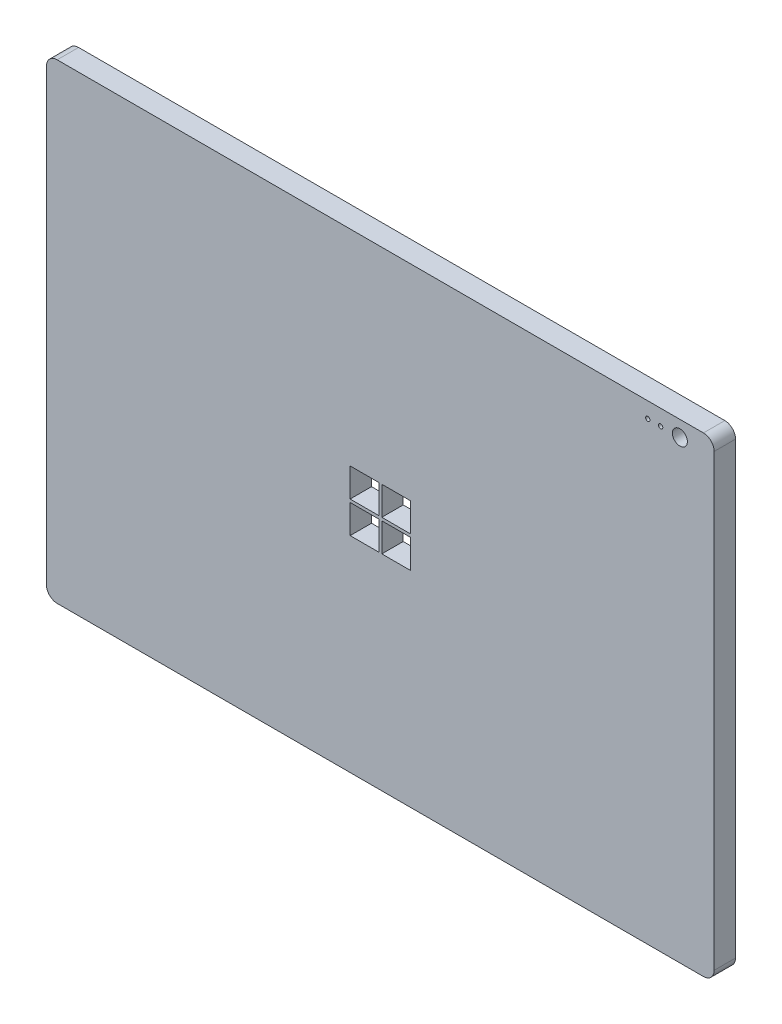
ISO-10303-21;
HEADER;
FILE_DESCRIPTION(('STEP AP214'),'2;1');
FILE_NAME('part.step','',(''),(''),'','','');
FILE_SCHEMA(('AUTOMOTIVE_DESIGN { 1 0 10303 214 1 1 1 1 }'));
ENDSEC;
DATA;
#1=APPLICATION_CONTEXT('core data for automotive mechanical design processes');
#2=APPLICATION_PROTOCOL_DEFINITION('international standard','automotive_design',2000,#1);
#3=PRODUCT_CONTEXT('',#1,'mechanical');
#4=PRODUCT('Part','Part','',(#3));
#5=PRODUCT_RELATED_PRODUCT_CATEGORY('part','',(#4));
#6=PRODUCT_DEFINITION_FORMATION('','',#4);
#7=PRODUCT_DEFINITION_CONTEXT('part definition',#1,'design');
#8=PRODUCT_DEFINITION('design','',#6,#7);
#9=PRODUCT_DEFINITION_SHAPE('','',#8);
#10=(LENGTH_UNIT() NAMED_UNIT(*) SI_UNIT(.MILLI.,.METRE.));
#11=(NAMED_UNIT(*) PLANE_ANGLE_UNIT() SI_UNIT($,.RADIAN.));
#12=(NAMED_UNIT(*) SI_UNIT($,.STERADIAN.) SOLID_ANGLE_UNIT());
#13=UNCERTAINTY_MEASURE_WITH_UNIT(LENGTH_MEASURE(1.E-05),#10,'distance_accuracy_value','');
#14=(GEOMETRIC_REPRESENTATION_CONTEXT(3) GLOBAL_UNCERTAINTY_ASSIGNED_CONTEXT((#13)) GLOBAL_UNIT_ASSIGNED_CONTEXT((#10,
#11,#12)) REPRESENTATION_CONTEXT('',''));
#15=CARTESIAN_POINT('',(0.,0.,0.));
#16=DIRECTION('',(0.,0.,1.));
#17=DIRECTION('',(1.,0.,0.));
#18=AXIS2_PLACEMENT_3D('',#15,#16,#17);
#19=CARTESIAN_POINT('',(0.,0.,10.));
#20=DIRECTION('',(0.,0.,-1.));
#21=DIRECTION('',(-1.,0.,0.));
#22=AXIS2_PLACEMENT_3D('',#19,#20,#21);
#23=PLANE('',#22);
#24=DIRECTION('',(0.,-1.,0.));
#25=VECTOR('',#24,1.);
#26=CARTESIAN_POINT('',(141.9,109.3,10.));
#27=LINE('',#26,#25);
#28=CARTESIAN_POINT('',(141.9,109.3,10.));
#29=VERTEX_POINT('',#28);
#30=CARTESIAN_POINT('',(141.9,95.9,10.));
#31=VERTEX_POINT('',#30);
#32=EDGE_CURVE('E436',#29,#31,#27,.T.);
#33=ORIENTED_EDGE('',*,*,#32,.F.);
#34=DIRECTION('',(-1.,0.,0.));
#35=VECTOR('',#34,1.);
#36=CARTESIAN_POINT('',(141.9,109.3,10.));
#37=LINE('',#36,#35);
#38=CARTESIAN_POINT('',(155.3,109.3,10.));
#39=VERTEX_POINT('',#38);
#40=EDGE_CURVE('E449',#39,#29,#37,.T.);
#41=ORIENTED_EDGE('',*,*,#40,.F.);
#42=DIRECTION('',(0.,1.,0.));
#43=VECTOR('',#42,1.);
#44=CARTESIAN_POINT('',(155.3,109.3,10.));
#45=LINE('',#44,#43);
#46=CARTESIAN_POINT('',(155.3,95.9,10.));
#47=VERTEX_POINT('',#46);
#48=EDGE_CURVE('E454',#47,#39,#45,.T.);
#49=ORIENTED_EDGE('',*,*,#48,.F.);
#50=DIRECTION('',(1.,0.,0.));
#51=VECTOR('',#50,1.);
#52=CARTESIAN_POINT('',(141.9,95.9,10.));
#53=LINE('',#52,#51);
#54=EDGE_CURVE('E440',#31,#47,#53,.T.);
#55=ORIENTED_EDGE('',*,*,#54,.F.);
#56=EDGE_LOOP('',(#33,#41,#49,#55));
#57=FACE_BOUND('',#56,.T.);
#58=DIRECTION('',(0.,-1.,0.));
#59=VECTOR('',#58,1.);
#60=CARTESIAN_POINT('',(141.9,124.1,10.));
#61=LINE('',#60,#59);
#62=CARTESIAN_POINT('',(141.9,124.1,10.));
#63=VERTEX_POINT('',#62);
#64=CARTESIAN_POINT('',(141.9,110.7,10.));
#65=VERTEX_POINT('',#64);
#66=EDGE_CURVE('E502',#63,#65,#61,.T.);
#67=ORIENTED_EDGE('',*,*,#66,.F.);
#68=DIRECTION('',(-1.,0.,0.));
#69=VECTOR('',#68,1.);
#70=CARTESIAN_POINT('',(141.9,124.1,10.));
#71=LINE('',#70,#69);
#72=CARTESIAN_POINT('',(155.3,124.1,10.));
#73=VERTEX_POINT('',#72);
#74=EDGE_CURVE('E515',#73,#63,#71,.T.);
#75=ORIENTED_EDGE('',*,*,#74,.F.);
#76=DIRECTION('',(0.,1.,0.));
#77=VECTOR('',#76,1.);
#78=CARTESIAN_POINT('',(155.3,124.1,10.));
#79=LINE('',#78,#77);
#80=CARTESIAN_POINT('',(155.3,110.7,10.));
#81=VERTEX_POINT('',#80);
#82=EDGE_CURVE('E520',#81,#73,#79,.T.);
#83=ORIENTED_EDGE('',*,*,#82,.F.);
#84=DIRECTION('',(1.,0.,0.));
#85=VECTOR('',#84,1.);
#86=CARTESIAN_POINT('',(141.9,110.7,10.));
#87=LINE('',#86,#85);
#88=EDGE_CURVE('E506',#65,#81,#87,.T.);
#89=ORIENTED_EDGE('',*,*,#88,.F.);
#90=EDGE_LOOP('',(#67,#75,#83,#89));
#91=FACE_BOUND('',#90,.T.);
#92=DIRECTION('',(-1.,0.,0.));
#93=VECTOR('',#92,1.);
#94=CARTESIAN_POINT('',(0.,220.,10.));
#95=LINE('',#94,#93);
#96=CARTESIAN_POINT('',(307.,220.,10.));
#97=VERTEX_POINT('',#96);
#98=CARTESIAN_POINT('',(5.,220.,10.));
#99=VERTEX_POINT('',#98);
#100=EDGE_CURVE('E367',#97,#99,#95,.T.);
#101=ORIENTED_EDGE('',*,*,#100,.T.);
#102=CARTESIAN_POINT('',(5.,215.,10.));
#103=DIRECTION('',(0.,0.,-1.));
#104=DIRECTION('',(-1.,0.,0.));
#105=AXIS2_PLACEMENT_3D('',#102,#103,#104);
#106=CIRCLE('',#105,5.);
#107=CARTESIAN_POINT('',(0.,215.,10.));
#108=VERTEX_POINT('',#107);
#109=EDGE_CURVE('E327',#99,#108,#106,.F.);
#110=ORIENTED_EDGE('',*,*,#109,.T.);
#111=DIRECTION('',(0.,-1.,0.));
#112=VECTOR('',#111,1.);
#113=CARTESIAN_POINT('',(0.,0.,10.));
#114=LINE('',#113,#112);
#115=CARTESIAN_POINT('',(0.,5.,10.));
#116=VERTEX_POINT('',#115);
#117=EDGE_CURVE('E363',#108,#116,#114,.T.);
#118=ORIENTED_EDGE('',*,*,#117,.T.);
#119=CARTESIAN_POINT('',(5.,5.,10.));
#120=DIRECTION('',(0.,0.,-1.));
#121=DIRECTION('',(-1.,0.,0.));
#122=AXIS2_PLACEMENT_3D('',#119,#120,#121);
#123=CIRCLE('',#122,5.);
#124=CARTESIAN_POINT('',(5.,0.,10.));
#125=VERTEX_POINT('',#124);
#126=EDGE_CURVE('E321',#116,#125,#123,.F.);
#127=ORIENTED_EDGE('',*,*,#126,.T.);
#128=DIRECTION('',(1.,0.,0.));
#129=VECTOR('',#128,1.);
#130=CARTESIAN_POINT('',(0.,0.,10.));
#131=LINE('',#130,#129);
#132=CARTESIAN_POINT('',(307.,0.,10.));
#133=VERTEX_POINT('',#132);
#134=EDGE_CURVE('E344',#125,#133,#131,.T.);
#135=ORIENTED_EDGE('',*,*,#134,.T.);
#136=CARTESIAN_POINT('',(307.,5.,10.));
#137=DIRECTION('',(0.,0.,-1.));
#138=DIRECTION('',(-1.,0.,0.));
#139=AXIS2_PLACEMENT_3D('',#136,#137,#138);
#140=CIRCLE('',#139,5.);
#141=CARTESIAN_POINT('',(312.,5.,10.));
#142=VERTEX_POINT('',#141);
#143=EDGE_CURVE('E59',#133,#142,#140,.F.);
#144=ORIENTED_EDGE('',*,*,#143,.T.);
#145=DIRECTION('',(0.,1.,0.));
#146=VECTOR('',#145,1.);
#147=CARTESIAN_POINT('',(312.,0.,10.));
#148=LINE('',#147,#146);
#149=CARTESIAN_POINT('',(312.,215.,10.));
#150=VERTEX_POINT('',#149);
#151=EDGE_CURVE('E389',#142,#150,#148,.T.);
#152=ORIENTED_EDGE('',*,*,#151,.T.);
#153=CARTESIAN_POINT('',(307.,215.,10.));
#154=DIRECTION('',(0.,0.,-1.));
#155=DIRECTION('',(-1.,0.,0.));
#156=AXIS2_PLACEMENT_3D('',#153,#154,#155);
#157=CIRCLE('',#156,5.);
#158=EDGE_CURVE('E322',#150,#97,#157,.F.);
#159=ORIENTED_EDGE('',*,*,#158,.T.);
#160=EDGE_LOOP('',(#101,#110,#118,#127,#135,#144,#152,#159));
#161=FACE_BOUND('',#160,.T.);
#162=DIRECTION('',(0.,-1.,0.));
#163=VECTOR('',#162,1.);
#164=CARTESIAN_POINT('',(156.7,124.1,10.));
#165=LINE('',#164,#163);
#166=CARTESIAN_POINT('',(156.7,124.1,10.));
#167=VERTEX_POINT('',#166);
#168=CARTESIAN_POINT('',(156.7,110.7,10.));
#169=VERTEX_POINT('',#168);
#170=EDGE_CURVE('E406',#167,#169,#165,.T.);
#171=ORIENTED_EDGE('',*,*,#170,.F.);
#172=DIRECTION('',(-1.,0.,0.));
#173=VECTOR('',#172,1.);
#174=CARTESIAN_POINT('',(156.7,124.1,10.));
#175=LINE('',#174,#173);
#176=CARTESIAN_POINT('',(170.1,124.1,10.));
#177=VERTEX_POINT('',#176);
#178=EDGE_CURVE('E485',#177,#167,#175,.T.);
#179=ORIENTED_EDGE('',*,*,#178,.F.);
#180=DIRECTION('',(0.,1.,0.));
#181=VECTOR('',#180,1.);
#182=CARTESIAN_POINT('',(170.1,124.1,10.));
#183=LINE('',#182,#181);
#184=CARTESIAN_POINT('',(170.1,110.7,10.));
#185=VERTEX_POINT('',#184);
#186=EDGE_CURVE('E418',#185,#177,#183,.T.);
#187=ORIENTED_EDGE('',*,*,#186,.F.);
#188=DIRECTION('',(1.,0.,0.));
#189=VECTOR('',#188,1.);
#190=CARTESIAN_POINT('',(156.7,110.7,10.));
#191=LINE('',#190,#189);
#192=EDGE_CURVE('E411',#169,#185,#191,.T.);
#193=ORIENTED_EDGE('',*,*,#192,.F.);
#194=EDGE_LOOP('',(#171,#179,#187,#193));
#195=FACE_BOUND('',#194,.T.);
#196=DIRECTION('',(0.,-1.,0.));
#197=VECTOR('',#196,1.);
#198=CARTESIAN_POINT('',(156.7,109.3,10.));
#199=LINE('',#198,#197);
#200=CARTESIAN_POINT('',(156.7,109.3,10.));
#201=VERTEX_POINT('',#200);
#202=CARTESIAN_POINT('',(156.7,95.9,10.));
#203=VERTEX_POINT('',#202);
#204=EDGE_CURVE('E201',#201,#203,#199,.T.);
#205=ORIENTED_EDGE('',*,*,#204,.F.);
#206=DIRECTION('',(-1.,0.,0.));
#207=VECTOR('',#206,1.);
#208=CARTESIAN_POINT('',(156.7,109.3,10.));
#209=LINE('',#208,#207);
#210=CARTESIAN_POINT('',(170.1,109.3,10.));
#211=VERTEX_POINT('',#210);
#212=EDGE_CURVE('E231',#211,#201,#209,.T.);
#213=ORIENTED_EDGE('',*,*,#212,.F.);
#214=DIRECTION('',(0.,1.,0.));
#215=VECTOR('',#214,1.);
#216=CARTESIAN_POINT('',(170.1,109.3,10.));
#217=LINE('',#216,#215);
#218=CARTESIAN_POINT('',(170.1,95.9,10.));
#219=VERTEX_POINT('',#218);
#220=EDGE_CURVE('E226',#219,#211,#217,.T.);
#221=ORIENTED_EDGE('',*,*,#220,.F.);
#222=DIRECTION('',(1.,0.,0.));
#223=VECTOR('',#222,1.);
#224=CARTESIAN_POINT('',(156.7,95.9,10.));
#225=LINE('',#224,#223);
#226=EDGE_CURVE('E212',#203,#219,#225,.T.);
#227=ORIENTED_EDGE('',*,*,#226,.F.);
#228=EDGE_LOOP('',(#205,#213,#221,#227));
#229=FACE_BOUND('',#228,.T.);
#230=CARTESIAN_POINT('',(296.,212.7,10.));
#231=DIRECTION('',(0.,0.,1.));
#232=DIRECTION('',(1.,0.,0.));
#233=AXIS2_PLACEMENT_3D('',#230,#231,#232);
#234=CIRCLE('',#233,3.50000000000002);
#235=CARTESIAN_POINT('',(299.5,212.7,10.));
#236=VERTEX_POINT('',#235);
#237=EDGE_CURVE('E244',#236,#236,#234,.T.);
#238=ORIENTED_EDGE('',*,*,#237,.F.);
#239=EDGE_LOOP('',(#238));
#240=FACE_BOUND('',#239,.T.);
#241=CARTESIAN_POINT('',(287.,212.7,10.));
#242=DIRECTION('',(0.,0.,1.));
#243=DIRECTION('',(1.,0.,0.));
#244=AXIS2_PLACEMENT_3D('',#241,#242,#243);
#245=CIRCLE('',#244,0.999999999999998);
#246=CARTESIAN_POINT('',(288.,212.7,10.));
#247=VERTEX_POINT('',#246);
#248=EDGE_CURVE('E252',#247,#247,#245,.T.);
#249=ORIENTED_EDGE('',*,*,#248,.F.);
#250=EDGE_LOOP('',(#249));
#251=FACE_BOUND('',#250,.T.);
#252=CARTESIAN_POINT('',(281.,212.7,10.));
#253=DIRECTION('',(0.,0.,1.));
#254=DIRECTION('',(1.,0.,0.));
#255=AXIS2_PLACEMENT_3D('',#252,#253,#254);
#256=CIRCLE('',#255,0.999999999999998);
#257=CARTESIAN_POINT('',(282.,212.7,10.));
#258=VERTEX_POINT('',#257);
#259=EDGE_CURVE('E261',#258,#258,#256,.T.);
#260=ORIENTED_EDGE('',*,*,#259,.F.);
#261=EDGE_LOOP('',(#260));
#262=FACE_BOUND('',#261,.T.);
#263=ADVANCED_FACE('F38',(#57,#91,#161,#195,#229,#240,#251,#262),#23,.F.);
#264=CARTESIAN_POINT('',(0.,0.,0.));
#265=DIRECTION('',(0.,0.,-1.));
#266=DIRECTION('',(-1.,0.,0.));
#267=AXIS2_PLACEMENT_3D('',#264,#265,#266);
#268=PLANE('',#267);
#269=CARTESIAN_POINT('',(287.,212.7,0.));
#270=DIRECTION('',(0.,0.,1.));
#271=DIRECTION('',(1.,0.,0.));
#272=AXIS2_PLACEMENT_3D('',#269,#270,#271);
#273=CIRCLE('',#272,0.999999999999998);
#274=CARTESIAN_POINT('',(288.,212.7,0.));
#275=VERTEX_POINT('',#274);
#276=EDGE_CURVE('E250',#275,#275,#273,.T.);
#277=ORIENTED_EDGE('',*,*,#276,.T.);
#278=EDGE_LOOP('',(#277));
#279=FACE_BOUND('',#278,.T.);
#280=DIRECTION('',(-1.,0.,0.));
#281=VECTOR('',#280,1.);
#282=CARTESIAN_POINT('',(156.7,109.3,0.));
#283=LINE('',#282,#281);
#284=CARTESIAN_POINT('',(170.1,109.3,0.));
#285=VERTEX_POINT('',#284);
#286=CARTESIAN_POINT('',(156.7,109.3,0.));
#287=VERTEX_POINT('',#286);
#288=EDGE_CURVE('E213',#285,#287,#283,.T.);
#289=ORIENTED_EDGE('',*,*,#288,.T.);
#290=DIRECTION('',(0.,-1.,0.));
#291=VECTOR('',#290,1.);
#292=CARTESIAN_POINT('',(156.7,109.3,0.));
#293=LINE('',#292,#291);
#294=CARTESIAN_POINT('',(156.7,95.9,0.));
#295=VERTEX_POINT('',#294);
#296=EDGE_CURVE('E248',#287,#295,#293,.T.);
#297=ORIENTED_EDGE('',*,*,#296,.T.);
#298=DIRECTION('',(1.,0.,0.));
#299=VECTOR('',#298,1.);
#300=CARTESIAN_POINT('',(156.7,95.9,0.));
#301=LINE('',#300,#299);
#302=CARTESIAN_POINT('',(170.1,95.9,0.));
#303=VERTEX_POINT('',#302);
#304=EDGE_CURVE('E219',#295,#303,#301,.T.);
#305=ORIENTED_EDGE('',*,*,#304,.T.);
#306=DIRECTION('',(0.,1.,0.));
#307=VECTOR('',#306,1.);
#308=CARTESIAN_POINT('',(170.1,109.3,0.));
#309=LINE('',#308,#307);
#310=EDGE_CURVE('E427',#303,#285,#309,.T.);
#311=ORIENTED_EDGE('',*,*,#310,.T.);
#312=EDGE_LOOP('',(#289,#297,#305,#311));
#313=FACE_BOUND('',#312,.T.);
#314=DIRECTION('',(-1.,0.,0.));
#315=VECTOR('',#314,1.);
#316=CARTESIAN_POINT('',(141.9,109.3,0.));
#317=LINE('',#316,#315);
#318=CARTESIAN_POINT('',(155.3,109.3,0.));
#319=VERTEX_POINT('',#318);
#320=CARTESIAN_POINT('',(141.9,109.3,0.));
#321=VERTEX_POINT('',#320);
#322=EDGE_CURVE('E441',#319,#321,#317,.T.);
#323=ORIENTED_EDGE('',*,*,#322,.T.);
#324=DIRECTION('',(0.,-1.,0.));
#325=VECTOR('',#324,1.);
#326=CARTESIAN_POINT('',(141.9,109.3,0.));
#327=LINE('',#326,#325);
#328=CARTESIAN_POINT('',(141.9,95.9,0.));
#329=VERTEX_POINT('',#328);
#330=EDGE_CURVE('E220',#321,#329,#327,.T.);
#331=ORIENTED_EDGE('',*,*,#330,.T.);
#332=DIRECTION('',(1.,0.,0.));
#333=VECTOR('',#332,1.);
#334=CARTESIAN_POINT('',(141.9,95.9,0.));
#335=LINE('',#334,#333);
#336=CARTESIAN_POINT('',(155.3,95.9,0.));
#337=VERTEX_POINT('',#336);
#338=EDGE_CURVE('E458',#329,#337,#335,.T.);
#339=ORIENTED_EDGE('',*,*,#338,.T.);
#340=DIRECTION('',(0.,1.,0.));
#341=VECTOR('',#340,1.);
#342=CARTESIAN_POINT('',(155.3,109.3,0.));
#343=LINE('',#342,#341);
#344=EDGE_CURVE('E461',#337,#319,#343,.T.);
#345=ORIENTED_EDGE('',*,*,#344,.T.);
#346=EDGE_LOOP('',(#323,#331,#339,#345));
#347=FACE_BOUND('',#346,.T.);
#348=DIRECTION('',(-1.,0.,0.));
#349=VECTOR('',#348,1.);
#350=CARTESIAN_POINT('',(156.7,124.1,0.));
#351=LINE('',#350,#349);
#352=CARTESIAN_POINT('',(170.1,124.1,0.));
#353=VERTEX_POINT('',#352);
#354=CARTESIAN_POINT('',(156.7,124.1,0.));
#355=VERTEX_POINT('',#354);
#356=EDGE_CURVE('E412',#353,#355,#351,.T.);
#357=ORIENTED_EDGE('',*,*,#356,.T.);
#358=DIRECTION('',(0.,-1.,0.));
#359=VECTOR('',#358,1.);
#360=CARTESIAN_POINT('',(156.7,124.1,0.));
#361=LINE('',#360,#359);
#362=CARTESIAN_POINT('',(156.7,110.7,0.));
#363=VERTEX_POINT('',#362);
#364=EDGE_CURVE('E474',#355,#363,#361,.T.);
#365=ORIENTED_EDGE('',*,*,#364,.T.);
#366=DIRECTION('',(1.,0.,0.));
#367=VECTOR('',#366,1.);
#368=CARTESIAN_POINT('',(156.7,110.7,0.));
#369=LINE('',#368,#367);
#370=CARTESIAN_POINT('',(170.1,110.7,0.));
#371=VERTEX_POINT('',#370);
#372=EDGE_CURVE('E478',#363,#371,#369,.T.);
#373=ORIENTED_EDGE('',*,*,#372,.T.);
#374=DIRECTION('',(0.,1.,0.));
#375=VECTOR('',#374,1.);
#376=CARTESIAN_POINT('',(170.1,124.1,0.));
#377=LINE('',#376,#375);
#378=EDGE_CURVE('E483',#371,#353,#377,.T.);
#379=ORIENTED_EDGE('',*,*,#378,.T.);
#380=EDGE_LOOP('',(#357,#365,#373,#379));
#381=FACE_BOUND('',#380,.T.);
#382=DIRECTION('',(-1.,0.,0.));
#383=VECTOR('',#382,1.);
#384=CARTESIAN_POINT('',(141.9,124.1,0.));
#385=LINE('',#384,#383);
#386=CARTESIAN_POINT('',(155.3,124.1,0.));
#387=VERTEX_POINT('',#386);
#388=CARTESIAN_POINT('',(141.9,124.1,0.));
#389=VERTEX_POINT('',#388);
#390=EDGE_CURVE('E507',#387,#389,#385,.T.);
#391=ORIENTED_EDGE('',*,*,#390,.T.);
#392=DIRECTION('',(0.,-1.,0.));
#393=VECTOR('',#392,1.);
#394=CARTESIAN_POINT('',(141.9,124.1,0.));
#395=LINE('',#394,#393);
#396=CARTESIAN_POINT('',(141.9,110.7,0.));
#397=VERTEX_POINT('',#396);
#398=EDGE_CURVE('E501',#389,#397,#395,.T.);
#399=ORIENTED_EDGE('',*,*,#398,.T.);
#400=DIRECTION('',(1.,0.,0.));
#401=VECTOR('',#400,1.);
#402=CARTESIAN_POINT('',(141.9,110.7,0.));
#403=LINE('',#402,#401);
#404=CARTESIAN_POINT('',(155.3,110.7,0.));
#405=VERTEX_POINT('',#404);
#406=EDGE_CURVE('E524',#397,#405,#403,.T.);
#407=ORIENTED_EDGE('',*,*,#406,.T.);
#408=DIRECTION('',(0.,1.,0.));
#409=VECTOR('',#408,1.);
#410=CARTESIAN_POINT('',(155.3,124.1,0.));
#411=LINE('',#410,#409);
#412=EDGE_CURVE('E527',#405,#387,#411,.T.);
#413=ORIENTED_EDGE('',*,*,#412,.T.);
#414=EDGE_LOOP('',(#391,#399,#407,#413));
#415=FACE_BOUND('',#414,.T.);
#416=DIRECTION('',(0.,-1.,0.));
#417=VECTOR('',#416,1.);
#418=CARTESIAN_POINT('',(0.,0.,0.));
#419=LINE('',#418,#417);
#420=CARTESIAN_POINT('',(0.,215.,0.));
#421=VERTEX_POINT('',#420);
#422=CARTESIAN_POINT('',(0.,5.,0.));
#423=VERTEX_POINT('',#422);
#424=EDGE_CURVE('E353',#421,#423,#419,.T.);
#425=ORIENTED_EDGE('',*,*,#424,.F.);
#426=CARTESIAN_POINT('',(5.,215.,0.));
#427=DIRECTION('',(0.,0.,-1.));
#428=DIRECTION('',(-1.,0.,0.));
#429=AXIS2_PLACEMENT_3D('',#426,#427,#428);
#430=CIRCLE('',#429,5.);
#431=CARTESIAN_POINT('',(5.,220.,0.));
#432=VERTEX_POINT('',#431);
#433=EDGE_CURVE('E374',#421,#432,#430,.T.);
#434=ORIENTED_EDGE('',*,*,#433,.T.);
#435=DIRECTION('',(-1.,0.,0.));
#436=VECTOR('',#435,1.);
#437=CARTESIAN_POINT('',(0.,220.,0.));
#438=LINE('',#437,#436);
#439=CARTESIAN_POINT('',(307.,220.,0.));
#440=VERTEX_POINT('',#439);
#441=EDGE_CURVE('E355',#440,#432,#438,.T.);
#442=ORIENTED_EDGE('',*,*,#441,.F.);
#443=CARTESIAN_POINT('',(307.,215.,0.));
#444=DIRECTION('',(0.,0.,-1.));
#445=DIRECTION('',(-1.,0.,0.));
#446=AXIS2_PLACEMENT_3D('',#443,#444,#445);
#447=CIRCLE('',#446,5.);
#448=CARTESIAN_POINT('',(312.,215.,0.));
#449=VERTEX_POINT('',#448);
#450=EDGE_CURVE('E370',#440,#449,#447,.T.);
#451=ORIENTED_EDGE('',*,*,#450,.T.);
#452=DIRECTION('',(0.,1.,0.));
#453=VECTOR('',#452,1.);
#454=CARTESIAN_POINT('',(312.,0.,0.));
#455=LINE('',#454,#453);
#456=CARTESIAN_POINT('',(312.,5.,0.));
#457=VERTEX_POINT('',#456);
#458=EDGE_CURVE('E352',#457,#449,#455,.T.);
#459=ORIENTED_EDGE('',*,*,#458,.F.);
#460=CARTESIAN_POINT('',(307.,5.,0.));
#461=DIRECTION('',(0.,0.,-1.));
#462=DIRECTION('',(-1.,0.,0.));
#463=AXIS2_PLACEMENT_3D('',#460,#461,#462);
#464=CIRCLE('',#463,5.);
#465=CARTESIAN_POINT('',(307.,0.,0.));
#466=VERTEX_POINT('',#465);
#467=EDGE_CURVE('E351',#457,#466,#464,.T.);
#468=ORIENTED_EDGE('',*,*,#467,.T.);
#469=DIRECTION('',(1.,0.,0.));
#470=VECTOR('',#469,1.);
#471=CARTESIAN_POINT('',(0.,0.,0.));
#472=LINE('',#471,#470);
#473=CARTESIAN_POINT('',(5.,0.,0.));
#474=VERTEX_POINT('',#473);
#475=EDGE_CURVE('E343',#474,#466,#472,.T.);
#476=ORIENTED_EDGE('',*,*,#475,.F.);
#477=CARTESIAN_POINT('',(5.,5.,0.));
#478=DIRECTION('',(0.,0.,-1.));
#479=DIRECTION('',(-1.,0.,0.));
#480=AXIS2_PLACEMENT_3D('',#477,#478,#479);
#481=CIRCLE('',#480,5.);
#482=EDGE_CURVE('E348',#474,#423,#481,.T.);
#483=ORIENTED_EDGE('',*,*,#482,.T.);
#484=EDGE_LOOP('',(#425,#434,#442,#451,#459,#468,#476,#483));
#485=FACE_BOUND('',#484,.T.);
#486=CARTESIAN_POINT('',(296.,212.7,0.));
#487=DIRECTION('',(0.,0.,1.));
#488=DIRECTION('',(1.,0.,0.));
#489=AXIS2_PLACEMENT_3D('',#486,#487,#488);
#490=CIRCLE('',#489,3.50000000000002);
#491=CARTESIAN_POINT('',(299.5,212.7,0.));
#492=VERTEX_POINT('',#491);
#493=EDGE_CURVE('E249',#492,#492,#490,.T.);
#494=ORIENTED_EDGE('',*,*,#493,.T.);
#495=EDGE_LOOP('',(#494));
#496=FACE_BOUND('',#495,.T.);
#497=CARTESIAN_POINT('',(281.,212.7,0.));
#498=DIRECTION('',(0.,0.,1.));
#499=DIRECTION('',(1.,0.,0.));
#500=AXIS2_PLACEMENT_3D('',#497,#498,#499);
#501=CIRCLE('',#500,0.999999999999998);
#502=CARTESIAN_POINT('',(282.,212.7,0.));
#503=VERTEX_POINT('',#502);
#504=EDGE_CURVE('E264',#503,#503,#501,.T.);
#505=ORIENTED_EDGE('',*,*,#504,.T.);
#506=EDGE_LOOP('',(#505));
#507=FACE_BOUND('',#506,.T.);
#508=ADVANCED_FACE('F274',(#279,#313,#347,#381,#415,#485,#496,#507),#268,.T.);
#509=CARTESIAN_POINT('',(0.,0.,10.));
#510=DIRECTION('',(1.,0.,0.));
#511=DIRECTION('',(0.,0.,-1.));
#512=AXIS2_PLACEMENT_3D('',#509,#510,#511);
#513=PLANE('',#512);
#514=ORIENTED_EDGE('',*,*,#117,.F.);
#515=DIRECTION('',(0.,0.,-1.));
#516=VECTOR('',#515,1.);
#517=CARTESIAN_POINT('',(0.,215.,10.));
#518=LINE('',#517,#516);
#519=EDGE_CURVE('E366',#108,#421,#518,.T.);
#520=ORIENTED_EDGE('',*,*,#519,.T.);
#521=ORIENTED_EDGE('',*,*,#424,.T.);
#522=DIRECTION('',(0.,0.,-1.));
#523=VECTOR('',#522,1.);
#524=CARTESIAN_POINT('',(0.,5.,10.));
#525=LINE('',#524,#523);
#526=EDGE_CURVE('E364',#423,#116,#525,.F.);
#527=ORIENTED_EDGE('',*,*,#526,.T.);
#528=EDGE_LOOP('',(#514,#520,#521,#527));
#529=FACE_BOUND('',#528,.T.);
#530=ADVANCED_FACE('F280',(#529),#513,.F.);
#531=CARTESIAN_POINT('',(0.,0.,10.));
#532=DIRECTION('',(0.,1.,0.));
#533=DIRECTION('',(0.,0.,1.));
#534=AXIS2_PLACEMENT_3D('',#531,#532,#533);
#535=PLANE('',#534);
#536=ORIENTED_EDGE('',*,*,#134,.F.);
#537=DIRECTION('',(0.,0.,-1.));
#538=VECTOR('',#537,1.);
#539=CARTESIAN_POINT('',(5.,0.,10.));
#540=LINE('',#539,#538);
#541=EDGE_CURVE('E337',#125,#474,#540,.T.);
#542=ORIENTED_EDGE('',*,*,#541,.T.);
#543=ORIENTED_EDGE('',*,*,#475,.T.);
#544=DIRECTION('',(0.,0.,-1.));
#545=VECTOR('',#544,1.);
#546=CARTESIAN_POINT('',(307.,0.,10.));
#547=LINE('',#546,#545);
#548=EDGE_CURVE('E319',#466,#133,#547,.F.);
#549=ORIENTED_EDGE('',*,*,#548,.T.);
#550=EDGE_LOOP('',(#536,#542,#543,#549));
#551=FACE_BOUND('',#550,.T.);
#552=ADVANCED_FACE('F296',(#551),#535,.F.);
#553=CARTESIAN_POINT('',(312.,0.,10.));
#554=DIRECTION('',(-1.,0.,0.));
#555=DIRECTION('',(0.,-1.,0.));
#556=AXIS2_PLACEMENT_3D('',#553,#554,#555);
#557=PLANE('',#556);
#558=ORIENTED_EDGE('',*,*,#151,.F.);
#559=DIRECTION('',(0.,0.,-1.));
#560=VECTOR('',#559,1.);
#561=CARTESIAN_POINT('',(312.,5.,10.));
#562=LINE('',#561,#560);
#563=EDGE_CURVE('E12',#142,#457,#562,.T.);
#564=ORIENTED_EDGE('',*,*,#563,.T.);
#565=ORIENTED_EDGE('',*,*,#458,.T.);
#566=DIRECTION('',(0.,0.,-1.));
#567=VECTOR('',#566,1.);
#568=CARTESIAN_POINT('',(312.,215.,10.));
#569=LINE('',#568,#567);
#570=EDGE_CURVE('E46',#449,#150,#569,.F.);
#571=ORIENTED_EDGE('',*,*,#570,.T.);
#572=EDGE_LOOP('',(#558,#564,#565,#571));
#573=FACE_BOUND('',#572,.T.);
#574=ADVANCED_FACE('F292',(#573),#557,.F.);
#575=CARTESIAN_POINT('',(0.,220.,10.));
#576=DIRECTION('',(0.,-1.,0.));
#577=DIRECTION('',(1.,0.,0.));
#578=AXIS2_PLACEMENT_3D('',#575,#576,#577);
#579=PLANE('',#578);
#580=ORIENTED_EDGE('',*,*,#441,.T.);
#581=DIRECTION('',(0.,0.,-1.));
#582=VECTOR('',#581,1.);
#583=CARTESIAN_POINT('',(5.,220.,10.));
#584=LINE('',#583,#582);
#585=EDGE_CURVE('E330',#432,#99,#584,.F.);
#586=ORIENTED_EDGE('',*,*,#585,.T.);
#587=ORIENTED_EDGE('',*,*,#100,.F.);
#588=DIRECTION('',(0.,0.,-1.));
#589=VECTOR('',#588,1.);
#590=CARTESIAN_POINT('',(307.,220.,10.));
#591=LINE('',#590,#589);
#592=EDGE_CURVE('E376',#97,#440,#591,.T.);
#593=ORIENTED_EDGE('',*,*,#592,.T.);
#594=EDGE_LOOP('',(#580,#586,#587,#593));
#595=FACE_BOUND('',#594,.T.);
#596=ADVANCED_FACE('F289',(#595),#579,.F.);
#597=CARTESIAN_POINT('',(141.9,124.1,10.));
#598=DIRECTION('',(1.,0.,0.));
#599=DIRECTION('',(0.,1.,0.));
#600=AXIS2_PLACEMENT_3D('',#597,#598,#599);
#601=PLANE('',#600);
#602=ORIENTED_EDGE('',*,*,#398,.F.);
#603=DIRECTION('',(0.,0.,-1.));
#604=VECTOR('',#603,1.);
#605=CARTESIAN_POINT('',(141.9,124.1,10.));
#606=LINE('',#605,#604);
#607=EDGE_CURVE('E519',#63,#389,#606,.T.);
#608=ORIENTED_EDGE('',*,*,#607,.F.);
#609=ORIENTED_EDGE('',*,*,#66,.T.);
#610=DIRECTION('',(0.,0.,-1.));
#611=VECTOR('',#610,1.);
#612=CARTESIAN_POINT('',(141.9,110.7,10.));
#613=LINE('',#612,#611);
#614=EDGE_CURVE('E357',#65,#397,#613,.T.);
#615=ORIENTED_EDGE('',*,*,#614,.T.);
#616=EDGE_LOOP('',(#602,#608,#609,#615));
#617=FACE_BOUND('',#616,.T.);
#618=ADVANCED_FACE('F286',(#617),#601,.T.);
#619=CARTESIAN_POINT('',(141.9,110.7,10.));
#620=DIRECTION('',(0.,1.,0.));
#621=DIRECTION('',(0.,0.,1.));
#622=AXIS2_PLACEMENT_3D('',#619,#620,#621);
#623=PLANE('',#622);
#624=ORIENTED_EDGE('',*,*,#406,.F.);
#625=ORIENTED_EDGE('',*,*,#614,.F.);
#626=ORIENTED_EDGE('',*,*,#88,.T.);
#627=DIRECTION('',(0.,0.,-1.));
#628=VECTOR('',#627,1.);
#629=CARTESIAN_POINT('',(155.3,110.7,10.));
#630=LINE('',#629,#628);
#631=EDGE_CURVE('E536',#81,#405,#630,.T.);
#632=ORIENTED_EDGE('',*,*,#631,.T.);
#633=EDGE_LOOP('',(#624,#625,#626,#632));
#634=FACE_BOUND('',#633,.T.);
#635=ADVANCED_FACE('F592',(#634),#623,.T.);
#636=CARTESIAN_POINT('',(155.3,124.1,10.));
#637=DIRECTION('',(-1.,0.,0.));
#638=DIRECTION('',(0.,-1.,0.));
#639=AXIS2_PLACEMENT_3D('',#636,#637,#638);
#640=PLANE('',#639);
#641=ORIENTED_EDGE('',*,*,#412,.F.);
#642=ORIENTED_EDGE('',*,*,#631,.F.);
#643=ORIENTED_EDGE('',*,*,#82,.T.);
#644=DIRECTION('',(0.,0.,-1.));
#645=VECTOR('',#644,1.);
#646=CARTESIAN_POINT('',(155.3,124.1,10.));
#647=LINE('',#646,#645);
#648=EDGE_CURVE('E534',#73,#387,#647,.T.);
#649=ORIENTED_EDGE('',*,*,#648,.T.);
#650=EDGE_LOOP('',(#641,#642,#643,#649));
#651=FACE_BOUND('',#650,.T.);
#652=ADVANCED_FACE('F589',(#651),#640,.T.);
#653=CARTESIAN_POINT('',(141.9,124.1,10.));
#654=DIRECTION('',(0.,-1.,0.));
#655=DIRECTION('',(0.,0.,-1.));
#656=AXIS2_PLACEMENT_3D('',#653,#654,#655);
#657=PLANE('',#656);
#658=ORIENTED_EDGE('',*,*,#390,.F.);
#659=ORIENTED_EDGE('',*,*,#648,.F.);
#660=ORIENTED_EDGE('',*,*,#74,.T.);
#661=ORIENTED_EDGE('',*,*,#607,.T.);
#662=EDGE_LOOP('',(#658,#659,#660,#661));
#663=FACE_BOUND('',#662,.T.);
#664=ADVANCED_FACE('F585',(#663),#657,.T.);
#665=CARTESIAN_POINT('',(156.7,124.1,10.));
#666=DIRECTION('',(1.,0.,0.));
#667=DIRECTION('',(0.,1.,0.));
#668=AXIS2_PLACEMENT_3D('',#665,#666,#667);
#669=PLANE('',#668);
#670=ORIENTED_EDGE('',*,*,#364,.F.);
#671=DIRECTION('',(0.,0.,-1.));
#672=VECTOR('',#671,1.);
#673=CARTESIAN_POINT('',(156.7,124.1,10.));
#674=LINE('',#673,#672);
#675=EDGE_CURVE('E491',#167,#355,#674,.T.);
#676=ORIENTED_EDGE('',*,*,#675,.F.);
#677=ORIENTED_EDGE('',*,*,#170,.T.);
#678=DIRECTION('',(0.,0.,-1.));
#679=VECTOR('',#678,1.);
#680=CARTESIAN_POINT('',(156.7,110.7,10.));
#681=LINE('',#680,#679);
#682=EDGE_CURVE('E498',#169,#363,#681,.T.);
#683=ORIENTED_EDGE('',*,*,#682,.T.);
#684=EDGE_LOOP('',(#670,#676,#677,#683));
#685=FACE_BOUND('',#684,.T.);
#686=ADVANCED_FACE('F581',(#685),#669,.T.);
#687=CARTESIAN_POINT('',(156.7,110.7,10.));
#688=DIRECTION('',(0.,1.,0.));
#689=DIRECTION('',(0.,0.,1.));
#690=AXIS2_PLACEMENT_3D('',#687,#688,#689);
#691=PLANE('',#690);
#692=ORIENTED_EDGE('',*,*,#372,.F.);
#693=ORIENTED_EDGE('',*,*,#682,.F.);
#694=ORIENTED_EDGE('',*,*,#192,.T.);
#695=DIRECTION('',(0.,0.,-1.));
#696=VECTOR('',#695,1.);
#697=CARTESIAN_POINT('',(170.1,110.7,10.));
#698=LINE('',#697,#696);
#699=EDGE_CURVE('E496',#185,#371,#698,.T.);
#700=ORIENTED_EDGE('',*,*,#699,.T.);
#701=EDGE_LOOP('',(#692,#693,#694,#700));
#702=FACE_BOUND('',#701,.T.);
#703=ADVANCED_FACE('F577',(#702),#691,.T.);
#704=CARTESIAN_POINT('',(170.1,124.1,10.));
#705=DIRECTION('',(-1.,0.,0.));
#706=DIRECTION('',(0.,0.,1.));
#707=AXIS2_PLACEMENT_3D('',#704,#705,#706);
#708=PLANE('',#707);
#709=ORIENTED_EDGE('',*,*,#378,.F.);
#710=ORIENTED_EDGE('',*,*,#699,.F.);
#711=ORIENTED_EDGE('',*,*,#186,.T.);
#712=DIRECTION('',(0.,0.,-1.));
#713=VECTOR('',#712,1.);
#714=CARTESIAN_POINT('',(170.1,124.1,10.));
#715=LINE('',#714,#713);
#716=EDGE_CURVE('E494',#177,#353,#715,.T.);
#717=ORIENTED_EDGE('',*,*,#716,.T.);
#718=EDGE_LOOP('',(#709,#710,#711,#717));
#719=FACE_BOUND('',#718,.T.);
#720=ADVANCED_FACE('F573',(#719),#708,.T.);
#721=CARTESIAN_POINT('',(156.7,124.1,10.));
#722=DIRECTION('',(0.,-1.,0.));
#723=DIRECTION('',(0.,0.,-1.));
#724=AXIS2_PLACEMENT_3D('',#721,#722,#723);
#725=PLANE('',#724);
#726=ORIENTED_EDGE('',*,*,#356,.F.);
#727=ORIENTED_EDGE('',*,*,#716,.F.);
#728=ORIENTED_EDGE('',*,*,#178,.T.);
#729=ORIENTED_EDGE('',*,*,#675,.T.);
#730=EDGE_LOOP('',(#726,#727,#728,#729));
#731=FACE_BOUND('',#730,.T.);
#732=ADVANCED_FACE('F567',(#731),#725,.T.);
#733=CARTESIAN_POINT('',(141.9,109.3,10.));
#734=DIRECTION('',(1.,0.,0.));
#735=DIRECTION('',(0.,0.,-1.));
#736=AXIS2_PLACEMENT_3D('',#733,#734,#735);
#737=PLANE('',#736);
#738=ORIENTED_EDGE('',*,*,#330,.F.);
#739=DIRECTION('',(0.,0.,-1.));
#740=VECTOR('',#739,1.);
#741=CARTESIAN_POINT('',(141.9,109.3,10.));
#742=LINE('',#741,#740);
#743=EDGE_CURVE('E453',#29,#321,#742,.T.);
#744=ORIENTED_EDGE('',*,*,#743,.F.);
#745=ORIENTED_EDGE('',*,*,#32,.T.);
#746=DIRECTION('',(0.,0.,-1.));
#747=VECTOR('',#746,1.);
#748=CARTESIAN_POINT('',(141.9,95.9,10.));
#749=LINE('',#748,#747);
#750=EDGE_CURVE('E413',#31,#329,#749,.T.);
#751=ORIENTED_EDGE('',*,*,#750,.T.);
#752=EDGE_LOOP('',(#738,#744,#745,#751));
#753=FACE_BOUND('',#752,.T.);
#754=ADVANCED_FACE('F557',(#753),#737,.T.);
#755=CARTESIAN_POINT('',(141.9,95.9,10.));
#756=DIRECTION('',(0.,1.,0.));
#757=DIRECTION('',(0.,0.,1.));
#758=AXIS2_PLACEMENT_3D('',#755,#756,#757);
#759=PLANE('',#758);
#760=ORIENTED_EDGE('',*,*,#338,.F.);
#761=ORIENTED_EDGE('',*,*,#750,.F.);
#762=ORIENTED_EDGE('',*,*,#54,.T.);
#763=DIRECTION('',(0.,0.,-1.));
#764=VECTOR('',#763,1.);
#765=CARTESIAN_POINT('',(155.3,95.9,10.));
#766=LINE('',#765,#764);
#767=EDGE_CURVE('E469',#47,#337,#766,.T.);
#768=ORIENTED_EDGE('',*,*,#767,.T.);
#769=EDGE_LOOP('',(#760,#761,#762,#768));
#770=FACE_BOUND('',#769,.T.);
#771=ADVANCED_FACE('F559',(#770),#759,.T.);
#772=CARTESIAN_POINT('',(155.3,109.3,10.));
#773=DIRECTION('',(-1.,0.,0.));
#774=DIRECTION('',(0.,-1.,0.));
#775=AXIS2_PLACEMENT_3D('',#772,#773,#774);
#776=PLANE('',#775);
#777=ORIENTED_EDGE('',*,*,#344,.F.);
#778=ORIENTED_EDGE('',*,*,#767,.F.);
#779=ORIENTED_EDGE('',*,*,#48,.T.);
#780=DIRECTION('',(0.,0.,-1.));
#781=VECTOR('',#780,1.);
#782=CARTESIAN_POINT('',(155.3,109.3,10.));
#783=LINE('',#782,#781);
#784=EDGE_CURVE('E468',#39,#319,#783,.T.);
#785=ORIENTED_EDGE('',*,*,#784,.T.);
#786=EDGE_LOOP('',(#777,#778,#779,#785));
#787=FACE_BOUND('',#786,.T.);
#788=ADVANCED_FACE('F551',(#787),#776,.T.);
#789=CARTESIAN_POINT('',(141.9,109.3,10.));
#790=DIRECTION('',(0.,-1.,0.));
#791=DIRECTION('',(0.,0.,-1.));
#792=AXIS2_PLACEMENT_3D('',#789,#790,#791);
#793=PLANE('',#792);
#794=ORIENTED_EDGE('',*,*,#322,.F.);
#795=ORIENTED_EDGE('',*,*,#784,.F.);
#796=ORIENTED_EDGE('',*,*,#40,.T.);
#797=ORIENTED_EDGE('',*,*,#743,.T.);
#798=EDGE_LOOP('',(#794,#795,#796,#797));
#799=FACE_BOUND('',#798,.T.);
#800=ADVANCED_FACE('F556',(#799),#793,.T.);
#801=CARTESIAN_POINT('',(156.7,109.3,10.));
#802=DIRECTION('',(1.,0.,0.));
#803=DIRECTION('',(0.,1.,0.));
#804=AXIS2_PLACEMENT_3D('',#801,#802,#803);
#805=PLANE('',#804);
#806=ORIENTED_EDGE('',*,*,#296,.F.);
#807=DIRECTION('',(0.,0.,-1.));
#808=VECTOR('',#807,1.);
#809=CARTESIAN_POINT('',(156.7,109.3,10.));
#810=LINE('',#809,#808);
#811=EDGE_CURVE('E207',#201,#287,#810,.T.);
#812=ORIENTED_EDGE('',*,*,#811,.F.);
#813=ORIENTED_EDGE('',*,*,#204,.T.);
#814=DIRECTION('',(0.,0.,-1.));
#815=VECTOR('',#814,1.);
#816=CARTESIAN_POINT('',(156.7,95.9,10.));
#817=LINE('',#816,#815);
#818=EDGE_CURVE('E204',#203,#295,#817,.T.);
#819=ORIENTED_EDGE('',*,*,#818,.T.);
#820=EDGE_LOOP('',(#806,#812,#813,#819));
#821=FACE_BOUND('',#820,.T.);
#822=ADVANCED_FACE('F203',(#821),#805,.T.);
#823=CARTESIAN_POINT('',(156.7,95.9,10.));
#824=DIRECTION('',(0.,1.,0.));
#825=DIRECTION('',(0.,0.,1.));
#826=AXIS2_PLACEMENT_3D('',#823,#824,#825);
#827=PLANE('',#826);
#828=ORIENTED_EDGE('',*,*,#304,.F.);
#829=ORIENTED_EDGE('',*,*,#818,.F.);
#830=ORIENTED_EDGE('',*,*,#226,.T.);
#831=DIRECTION('',(0.,0.,-1.));
#832=VECTOR('',#831,1.);
#833=CARTESIAN_POINT('',(170.1,95.9,10.));
#834=LINE('',#833,#832);
#835=EDGE_CURVE('E221',#219,#303,#834,.T.);
#836=ORIENTED_EDGE('',*,*,#835,.T.);
#837=EDGE_LOOP('',(#828,#829,#830,#836));
#838=FACE_BOUND('',#837,.T.);
#839=ADVANCED_FACE('F216',(#838),#827,.T.);
#840=CARTESIAN_POINT('',(170.1,109.3,10.));
#841=DIRECTION('',(-1.,0.,0.));
#842=DIRECTION('',(0.,0.,1.));
#843=AXIS2_PLACEMENT_3D('',#840,#841,#842);
#844=PLANE('',#843);
#845=ORIENTED_EDGE('',*,*,#310,.F.);
#846=ORIENTED_EDGE('',*,*,#835,.F.);
#847=ORIENTED_EDGE('',*,*,#220,.T.);
#848=DIRECTION('',(0.,0.,-1.));
#849=VECTOR('',#848,1.);
#850=CARTESIAN_POINT('',(170.1,109.3,10.));
#851=LINE('',#850,#849);
#852=EDGE_CURVE('E433',#211,#285,#851,.T.);
#853=ORIENTED_EDGE('',*,*,#852,.T.);
#854=EDGE_LOOP('',(#845,#846,#847,#853));
#855=FACE_BOUND('',#854,.T.);
#856=ADVANCED_FACE('F675',(#855),#844,.T.);
#857=CARTESIAN_POINT('',(156.7,109.3,10.));
#858=DIRECTION('',(0.,-1.,0.));
#859=DIRECTION('',(0.,0.,-1.));
#860=AXIS2_PLACEMENT_3D('',#857,#858,#859);
#861=PLANE('',#860);
#862=ORIENTED_EDGE('',*,*,#288,.F.);
#863=ORIENTED_EDGE('',*,*,#852,.F.);
#864=ORIENTED_EDGE('',*,*,#212,.T.);
#865=ORIENTED_EDGE('',*,*,#811,.T.);
#866=EDGE_LOOP('',(#862,#863,#864,#865));
#867=FACE_BOUND('',#866,.T.);
#868=ADVANCED_FACE('F665',(#867),#861,.T.);
#869=CARTESIAN_POINT('',(296.,212.7,10.));
#870=DIRECTION('',(0.,0.,-1.));
#871=DIRECTION('',(-1.,0.,0.));
#872=AXIS2_PLACEMENT_3D('',#869,#870,#871);
#873=CYLINDRICAL_SURFACE('',#872,3.50000000000002);
#874=ORIENTED_EDGE('',*,*,#237,.T.);
#875=EDGE_LOOP('',(#874));
#876=FACE_BOUND('',#875,.T.);
#877=ORIENTED_EDGE('',*,*,#493,.F.);
#878=EDGE_LOOP('',(#877));
#879=FACE_BOUND('',#878,.T.);
#880=ADVANCED_FACE('F656',(#876,#879),#873,.F.);
#881=CARTESIAN_POINT('',(287.,212.7,10.));
#882=DIRECTION('',(0.,0.,-1.));
#883=DIRECTION('',(-1.,0.,0.));
#884=AXIS2_PLACEMENT_3D('',#881,#882,#883);
#885=CYLINDRICAL_SURFACE('',#884,0.999999999999998);
#886=ORIENTED_EDGE('',*,*,#248,.T.);
#887=EDGE_LOOP('',(#886));
#888=FACE_BOUND('',#887,.T.);
#889=ORIENTED_EDGE('',*,*,#276,.F.);
#890=EDGE_LOOP('',(#889));
#891=FACE_BOUND('',#890,.T.);
#892=ADVANCED_FACE('F646',(#888,#891),#885,.F.);
#893=CARTESIAN_POINT('',(281.,212.7,10.));
#894=DIRECTION('',(0.,0.,-1.));
#895=DIRECTION('',(-1.,0.,0.));
#896=AXIS2_PLACEMENT_3D('',#893,#894,#895);
#897=CYLINDRICAL_SURFACE('',#896,0.999999999999998);
#898=ORIENTED_EDGE('',*,*,#259,.T.);
#899=EDGE_LOOP('',(#898));
#900=FACE_BOUND('',#899,.T.);
#901=ORIENTED_EDGE('',*,*,#504,.F.);
#902=EDGE_LOOP('',(#901));
#903=FACE_BOUND('',#902,.T.);
#904=ADVANCED_FACE('F270',(#900,#903),#897,.F.);
#905=CARTESIAN_POINT('',(5.,215.,10.));
#906=DIRECTION('',(0.,0.,-1.));
#907=DIRECTION('',(-1.,0.,0.));
#908=AXIS2_PLACEMENT_3D('',#905,#906,#907);
#909=CYLINDRICAL_SURFACE('',#908,5.);
#910=ORIENTED_EDGE('',*,*,#109,.F.);
#911=ORIENTED_EDGE('',*,*,#585,.F.);
#912=ORIENTED_EDGE('',*,*,#433,.F.);
#913=ORIENTED_EDGE('',*,*,#519,.F.);
#914=EDGE_LOOP('',(#910,#911,#912,#913));
#915=FACE_BOUND('',#914,.T.);
#916=ADVANCED_FACE('F303',(#915),#909,.T.);
#917=CARTESIAN_POINT('',(5.,5.,10.));
#918=DIRECTION('',(0.,0.,-1.));
#919=DIRECTION('',(-1.,0.,0.));
#920=AXIS2_PLACEMENT_3D('',#917,#918,#919);
#921=CYLINDRICAL_SURFACE('',#920,5.);
#922=ORIENTED_EDGE('',*,*,#126,.F.);
#923=ORIENTED_EDGE('',*,*,#526,.F.);
#924=ORIENTED_EDGE('',*,*,#482,.F.);
#925=ORIENTED_EDGE('',*,*,#541,.F.);
#926=EDGE_LOOP('',(#922,#923,#924,#925));
#927=FACE_BOUND('',#926,.T.);
#928=ADVANCED_FACE('F306',(#927),#921,.T.);
#929=CARTESIAN_POINT('',(307.,5.,10.));
#930=DIRECTION('',(0.,0.,-1.));
#931=DIRECTION('',(-1.,0.,0.));
#932=AXIS2_PLACEMENT_3D('',#929,#930,#931);
#933=CYLINDRICAL_SURFACE('',#932,5.);
#934=ORIENTED_EDGE('',*,*,#143,.F.);
#935=ORIENTED_EDGE('',*,*,#548,.F.);
#936=ORIENTED_EDGE('',*,*,#467,.F.);
#937=ORIENTED_EDGE('',*,*,#563,.F.);
#938=EDGE_LOOP('',(#934,#935,#936,#937));
#939=FACE_BOUND('',#938,.T.);
#940=ADVANCED_FACE('F309',(#939),#933,.T.);
#941=CARTESIAN_POINT('',(307.,215.,10.));
#942=DIRECTION('',(0.,0.,-1.));
#943=DIRECTION('',(-1.,0.,0.));
#944=AXIS2_PLACEMENT_3D('',#941,#942,#943);
#945=CYLINDRICAL_SURFACE('',#944,5.);
#946=ORIENTED_EDGE('',*,*,#158,.F.);
#947=ORIENTED_EDGE('',*,*,#570,.F.);
#948=ORIENTED_EDGE('',*,*,#450,.F.);
#949=ORIENTED_EDGE('',*,*,#592,.F.);
#950=EDGE_LOOP('',(#946,#947,#948,#949));
#951=FACE_BOUND('',#950,.T.);
#952=ADVANCED_FACE('F40',(#951),#945,.T.);
#953=CLOSED_SHELL('',(#263,#508,#530,#552,#574,#596,#618,#635,#652,#664,#686,#703,#720,#732,
#754,#771,#788,#800,#822,#839,#856,#868,#880,#892,#904,#916,#928,#940,#952));
#954=MANIFOLD_SOLID_BREP('B2',#953);
#955=ADVANCED_BREP_SHAPE_REPRESENTATION('',(#18,#954),#14);
#956=SHAPE_DEFINITION_REPRESENTATION(#9,#955);
ENDSEC;
END-ISO-10303-21;
